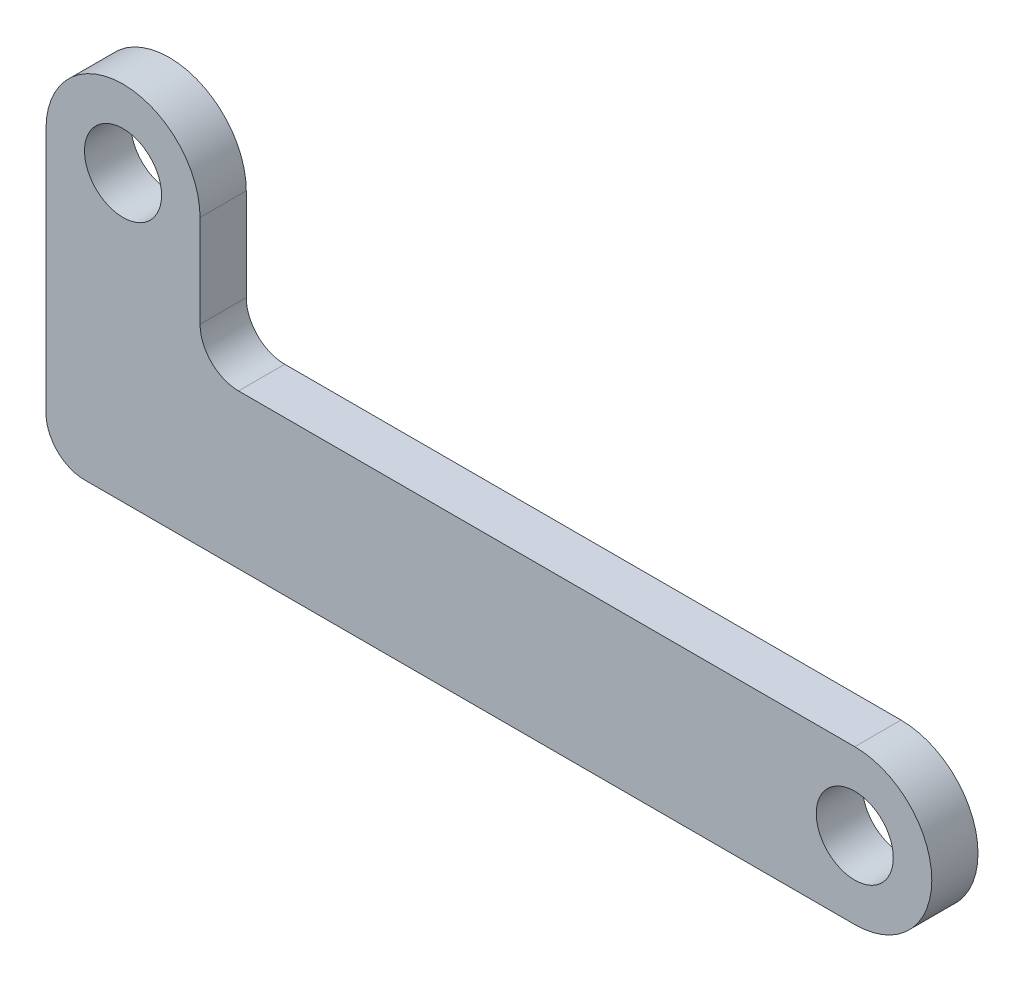
ISO-10303-21;
HEADER;
FILE_DESCRIPTION(('STEP AP214'),'2;1');
FILE_NAME('part.step','',(''),(''),'','','');
FILE_SCHEMA(('AUTOMOTIVE_DESIGN { 1 0 10303 214 1 1 1 1 }'));
ENDSEC;
DATA;
#1=APPLICATION_CONTEXT('core data for automotive mechanical design processes');
#2=APPLICATION_PROTOCOL_DEFINITION('international standard','automotive_design',2000,#1);
#3=PRODUCT_CONTEXT('',#1,'mechanical');
#4=PRODUCT('Part','Part','',(#3));
#5=PRODUCT_RELATED_PRODUCT_CATEGORY('part','',(#4));
#6=PRODUCT_DEFINITION_FORMATION('','',#4);
#7=PRODUCT_DEFINITION_CONTEXT('part definition',#1,'design');
#8=PRODUCT_DEFINITION('design','',#6,#7);
#9=PRODUCT_DEFINITION_SHAPE('','',#8);
#10=(LENGTH_UNIT() NAMED_UNIT(*) SI_UNIT(.MILLI.,.METRE.));
#11=(NAMED_UNIT(*) PLANE_ANGLE_UNIT() SI_UNIT($,.RADIAN.));
#12=(NAMED_UNIT(*) SI_UNIT($,.STERADIAN.) SOLID_ANGLE_UNIT());
#13=UNCERTAINTY_MEASURE_WITH_UNIT(LENGTH_MEASURE(1.E-05),#10,'distance_accuracy_value','');
#14=(GEOMETRIC_REPRESENTATION_CONTEXT(3) GLOBAL_UNCERTAINTY_ASSIGNED_CONTEXT((#13)) GLOBAL_UNIT_ASSIGNED_CONTEXT((#10,
#11,#12)) REPRESENTATION_CONTEXT('',''));
#15=CARTESIAN_POINT('',(0.,0.,0.));
#16=DIRECTION('',(0.,0.,1.));
#17=DIRECTION('',(1.,0.,0.));
#18=AXIS2_PLACEMENT_3D('',#15,#16,#17);
#19=CARTESIAN_POINT('',(0.,0.,3.));
#20=DIRECTION('',(0.,0.,1.));
#21=DIRECTION('',(1.,0.,0.));
#22=AXIS2_PLACEMENT_3D('',#19,#20,#21);
#23=PLANE('',#22);
#24=CARTESIAN_POINT('',(0.,0.,3.));
#25=DIRECTION('',(0.,0.,1.));
#26=DIRECTION('',(1.,0.,0.));
#27=AXIS2_PLACEMENT_3D('',#24,#25,#26);
#28=CIRCLE('',#27,2.5);
#29=CARTESIAN_POINT('',(2.5,0.,3.));
#30=VERTEX_POINT('',#29);
#31=EDGE_CURVE('E132',#30,#30,#28,.T.);
#32=ORIENTED_EDGE('',*,*,#31,.F.);
#33=EDGE_LOOP('',(#32));
#34=FACE_BOUND('',#33,.T.);
#35=CARTESIAN_POINT('',(0.,0.,3.));
#36=DIRECTION('',(0.,0.,1.));
#37=DIRECTION('',(1.,0.,0.));
#38=AXIS2_PLACEMENT_3D('',#35,#36,#37);
#39=CIRCLE('',#38,5.);
#40=CARTESIAN_POINT('',(5.,0.,3.));
#41=VERTEX_POINT('',#40);
#42=CARTESIAN_POINT('',(-5.,0.,3.));
#43=VERTEX_POINT('',#42);
#44=EDGE_CURVE('E143',#41,#43,#39,.T.);
#45=ORIENTED_EDGE('',*,*,#44,.T.);
#46=DIRECTION('',(0.,-1.,0.));
#47=VECTOR('',#46,1.);
#48=CARTESIAN_POINT('',(-5.,0.,3.));
#49=LINE('',#48,#47);
#50=CARTESIAN_POINT('',(-5.,-16.,3.));
#51=VERTEX_POINT('',#50);
#52=EDGE_CURVE('E91',#43,#51,#49,.T.);
#53=ORIENTED_EDGE('',*,*,#52,.T.);
#54=CARTESIAN_POINT('',(-2.5,-16.,3.));
#55=DIRECTION('',(0.,0.,1.));
#56=DIRECTION('',(1.,0.,0.));
#57=AXIS2_PLACEMENT_3D('',#54,#55,#56);
#58=CIRCLE('',#57,2.5);
#59=CARTESIAN_POINT('',(-2.5,-18.5,3.));
#60=VERTEX_POINT('',#59);
#61=EDGE_CURVE('E158',#51,#60,#58,.T.);
#62=ORIENTED_EDGE('',*,*,#61,.T.);
#63=DIRECTION('',(1.,0.,0.));
#64=VECTOR('',#63,1.);
#65=CARTESIAN_POINT('',(-2.5,-18.5,3.));
#66=LINE('',#65,#64);
#67=CARTESIAN_POINT('',(47.5,-18.5,3.));
#68=VERTEX_POINT('',#67);
#69=EDGE_CURVE('E171',#60,#68,#66,.T.);
#70=ORIENTED_EDGE('',*,*,#69,.T.);
#71=CARTESIAN_POINT('',(47.5,-13.5,3.));
#72=DIRECTION('',(0.,0.,1.));
#73=DIRECTION('',(-1.,0.,0.));
#74=AXIS2_PLACEMENT_3D('',#71,#72,#73);
#75=CIRCLE('',#74,5.);
#76=CARTESIAN_POINT('',(47.5,-8.5,3.));
#77=VERTEX_POINT('',#76);
#78=EDGE_CURVE('E110',#68,#77,#75,.T.);
#79=ORIENTED_EDGE('',*,*,#78,.T.);
#80=DIRECTION('',(-1.,0.,0.));
#81=VECTOR('',#80,1.);
#82=CARTESIAN_POINT('',(7.5,-8.50000000000001,3.));
#83=LINE('',#82,#81);
#84=CARTESIAN_POINT('',(7.5,-8.5,3.));
#85=VERTEX_POINT('',#84);
#86=EDGE_CURVE('E104',#77,#85,#83,.T.);
#87=ORIENTED_EDGE('',*,*,#86,.T.);
#88=CARTESIAN_POINT('',(7.5,-6.,3.));
#89=DIRECTION('',(0.,0.,-1.));
#90=DIRECTION('',(1.,0.,0.));
#91=AXIS2_PLACEMENT_3D('',#88,#89,#90);
#92=CIRCLE('',#91,2.5);
#93=CARTESIAN_POINT('',(5.,-6.,3.));
#94=VERTEX_POINT('',#93);
#95=EDGE_CURVE('E108',#85,#94,#92,.T.);
#96=ORIENTED_EDGE('',*,*,#95,.T.);
#97=DIRECTION('',(0.,1.,0.));
#98=VECTOR('',#97,1.);
#99=CARTESIAN_POINT('',(5.,0.,3.));
#100=LINE('',#99,#98);
#101=EDGE_CURVE('E48',#94,#41,#100,.T.);
#102=ORIENTED_EDGE('',*,*,#101,.T.);
#103=EDGE_LOOP('',(#45,#53,#62,#70,#79,#87,#96,#102));
#104=FACE_BOUND('',#103,.T.);
#105=CARTESIAN_POINT('',(47.5,-13.5,3.));
#106=DIRECTION('',(0.,0.,1.));
#107=DIRECTION('',(1.,0.,0.));
#108=AXIS2_PLACEMENT_3D('',#105,#106,#107);
#109=CIRCLE('',#108,2.5);
#110=CARTESIAN_POINT('',(50.,-13.5,3.));
#111=VERTEX_POINT('',#110);
#112=EDGE_CURVE('E180',#111,#111,#109,.T.);
#113=ORIENTED_EDGE('',*,*,#112,.F.);
#114=EDGE_LOOP('',(#113));
#115=FACE_BOUND('',#114,.T.);
#116=ADVANCED_FACE('F31',(#34,#104,#115),#23,.T.);
#117=CARTESIAN_POINT('',(0.,0.,0.));
#118=DIRECTION('',(0.,0.,1.));
#119=DIRECTION('',(1.,0.,0.));
#120=AXIS2_PLACEMENT_3D('',#117,#118,#119);
#121=PLANE('',#120);
#122=CARTESIAN_POINT('',(0.,0.,0.));
#123=DIRECTION('',(0.,0.,1.));
#124=DIRECTION('',(1.,0.,0.));
#125=AXIS2_PLACEMENT_3D('',#122,#123,#124);
#126=CIRCLE('',#125,2.5);
#127=CARTESIAN_POINT('',(2.5,0.,0.));
#128=VERTEX_POINT('',#127);
#129=EDGE_CURVE('E177',#128,#128,#126,.T.);
#130=ORIENTED_EDGE('',*,*,#129,.T.);
#131=EDGE_LOOP('',(#130));
#132=FACE_BOUND('',#131,.T.);
#133=CARTESIAN_POINT('',(0.,0.,0.));
#134=DIRECTION('',(0.,0.,1.));
#135=DIRECTION('',(1.,0.,0.));
#136=AXIS2_PLACEMENT_3D('',#133,#134,#135);
#137=CIRCLE('',#136,5.);
#138=CARTESIAN_POINT('',(5.,0.,0.));
#139=VERTEX_POINT('',#138);
#140=CARTESIAN_POINT('',(-5.,0.,0.));
#141=VERTEX_POINT('',#140);
#142=EDGE_CURVE('E128',#139,#141,#137,.T.);
#143=ORIENTED_EDGE('',*,*,#142,.F.);
#144=DIRECTION('',(0.,1.,0.));
#145=VECTOR('',#144,1.);
#146=CARTESIAN_POINT('',(5.,0.,0.));
#147=LINE('',#146,#145);
#148=CARTESIAN_POINT('',(5.,-6.,0.));
#149=VERTEX_POINT('',#148);
#150=EDGE_CURVE('E83',#149,#139,#147,.T.);
#151=ORIENTED_EDGE('',*,*,#150,.F.);
#152=CARTESIAN_POINT('',(7.5,-6.,0.));
#153=DIRECTION('',(0.,0.,-1.));
#154=DIRECTION('',(1.,0.,0.));
#155=AXIS2_PLACEMENT_3D('',#152,#153,#154);
#156=CIRCLE('',#155,2.5);
#157=CARTESIAN_POINT('',(7.5,-8.5,0.));
#158=VERTEX_POINT('',#157);
#159=EDGE_CURVE('E77',#158,#149,#156,.T.);
#160=ORIENTED_EDGE('',*,*,#159,.F.);
#161=DIRECTION('',(-1.,0.,0.));
#162=VECTOR('',#161,1.);
#163=CARTESIAN_POINT('',(7.5,-8.50000000000001,0.));
#164=LINE('',#163,#162);
#165=CARTESIAN_POINT('',(47.5,-8.5,0.));
#166=VERTEX_POINT('',#165);
#167=EDGE_CURVE('E118',#166,#158,#164,.T.);
#168=ORIENTED_EDGE('',*,*,#167,.F.);
#169=CARTESIAN_POINT('',(47.5,-13.5,0.));
#170=DIRECTION('',(0.,0.,1.));
#171=DIRECTION('',(-1.,0.,0.));
#172=AXIS2_PLACEMENT_3D('',#169,#170,#171);
#173=CIRCLE('',#172,5.);
#174=CARTESIAN_POINT('',(47.5,-18.5,0.));
#175=VERTEX_POINT('',#174);
#176=EDGE_CURVE('E138',#175,#166,#173,.T.);
#177=ORIENTED_EDGE('',*,*,#176,.F.);
#178=DIRECTION('',(1.,0.,0.));
#179=VECTOR('',#178,1.);
#180=CARTESIAN_POINT('',(-2.5,-18.5,0.));
#181=LINE('',#180,#179);
#182=CARTESIAN_POINT('',(-2.5,-18.5,0.));
#183=VERTEX_POINT('',#182);
#184=EDGE_CURVE('E136',#183,#175,#181,.T.);
#185=ORIENTED_EDGE('',*,*,#184,.F.);
#186=CARTESIAN_POINT('',(-2.5,-16.,0.));
#187=DIRECTION('',(0.,0.,1.));
#188=DIRECTION('',(1.,0.,0.));
#189=AXIS2_PLACEMENT_3D('',#186,#187,#188);
#190=CIRCLE('',#189,2.5);
#191=CARTESIAN_POINT('',(-5.,-16.,0.));
#192=VERTEX_POINT('',#191);
#193=EDGE_CURVE('E134',#192,#183,#190,.T.);
#194=ORIENTED_EDGE('',*,*,#193,.F.);
#195=DIRECTION('',(0.,-1.,0.));
#196=VECTOR('',#195,1.);
#197=CARTESIAN_POINT('',(-5.,0.,0.));
#198=LINE('',#197,#196);
#199=EDGE_CURVE('E131',#141,#192,#198,.T.);
#200=ORIENTED_EDGE('',*,*,#199,.F.);
#201=EDGE_LOOP('',(#143,#151,#160,#168,#177,#185,#194,#200));
#202=FACE_BOUND('',#201,.T.);
#203=CARTESIAN_POINT('',(47.5,-13.5,0.));
#204=DIRECTION('',(0.,0.,1.));
#205=DIRECTION('',(1.,0.,0.));
#206=AXIS2_PLACEMENT_3D('',#203,#204,#205);
#207=CIRCLE('',#206,2.5);
#208=CARTESIAN_POINT('',(50.,-13.5,0.));
#209=VERTEX_POINT('',#208);
#210=EDGE_CURVE('E183',#209,#209,#207,.T.);
#211=ORIENTED_EDGE('',*,*,#210,.T.);
#212=EDGE_LOOP('',(#211));
#213=FACE_BOUND('',#212,.T.);
#214=ADVANCED_FACE('F162',(#132,#202,#213),#121,.F.);
#215=CARTESIAN_POINT('',(0.,0.,3.));
#216=DIRECTION('',(0.,0.,-1.));
#217=DIRECTION('',(-1.,0.,0.));
#218=AXIS2_PLACEMENT_3D('',#215,#216,#217);
#219=CYLINDRICAL_SURFACE('',#218,5.);
#220=ORIENTED_EDGE('',*,*,#142,.T.);
#221=DIRECTION('',(0.,0.,-1.));
#222=VECTOR('',#221,1.);
#223=CARTESIAN_POINT('',(-5.,0.,3.));
#224=LINE('',#223,#222);
#225=EDGE_CURVE('E11',#43,#141,#224,.T.);
#226=ORIENTED_EDGE('',*,*,#225,.F.);
#227=ORIENTED_EDGE('',*,*,#44,.F.);
#228=DIRECTION('',(0.,0.,-1.));
#229=VECTOR('',#228,1.);
#230=CARTESIAN_POINT('',(5.,0.,3.));
#231=LINE('',#230,#229);
#232=EDGE_CURVE('E124',#41,#139,#231,.T.);
#233=ORIENTED_EDGE('',*,*,#232,.T.);
#234=EDGE_LOOP('',(#220,#226,#227,#233));
#235=FACE_BOUND('',#234,.T.);
#236=ADVANCED_FACE('F33',(#235),#219,.T.);
#237=CARTESIAN_POINT('',(-5.,0.,3.));
#238=DIRECTION('',(1.,0.,0.));
#239=DIRECTION('',(0.,1.,0.));
#240=AXIS2_PLACEMENT_3D('',#237,#238,#239);
#241=PLANE('',#240);
#242=ORIENTED_EDGE('',*,*,#199,.T.);
#243=DIRECTION('',(0.,0.,-1.));
#244=VECTOR('',#243,1.);
#245=CARTESIAN_POINT('',(-5.,-16.,3.));
#246=LINE('',#245,#244);
#247=EDGE_CURVE('E40',#51,#192,#246,.T.);
#248=ORIENTED_EDGE('',*,*,#247,.F.);
#249=ORIENTED_EDGE('',*,*,#52,.F.);
#250=ORIENTED_EDGE('',*,*,#225,.T.);
#251=EDGE_LOOP('',(#242,#248,#249,#250));
#252=FACE_BOUND('',#251,.T.);
#253=ADVANCED_FACE('F216',(#252),#241,.F.);
#254=CARTESIAN_POINT('',(-2.5,-16.,3.));
#255=DIRECTION('',(0.,0.,-1.));
#256=DIRECTION('',(-1.,0.,0.));
#257=AXIS2_PLACEMENT_3D('',#254,#255,#256);
#258=CYLINDRICAL_SURFACE('',#257,2.5);
#259=ORIENTED_EDGE('',*,*,#193,.T.);
#260=DIRECTION('',(0.,0.,-1.));
#261=VECTOR('',#260,1.);
#262=CARTESIAN_POINT('',(-2.5,-18.5,3.));
#263=LINE('',#262,#261);
#264=EDGE_CURVE('E150',#60,#183,#263,.T.);
#265=ORIENTED_EDGE('',*,*,#264,.F.);
#266=ORIENTED_EDGE('',*,*,#61,.F.);
#267=ORIENTED_EDGE('',*,*,#247,.T.);
#268=EDGE_LOOP('',(#259,#265,#266,#267));
#269=FACE_BOUND('',#268,.T.);
#270=ADVANCED_FACE('F156',(#269),#258,.T.);
#271=CARTESIAN_POINT('',(-2.5,-18.5,3.));
#272=DIRECTION('',(0.,1.,0.));
#273=DIRECTION('',(0.,0.,1.));
#274=AXIS2_PLACEMENT_3D('',#271,#272,#273);
#275=PLANE('',#274);
#276=ORIENTED_EDGE('',*,*,#184,.T.);
#277=DIRECTION('',(0.,0.,-1.));
#278=VECTOR('',#277,1.);
#279=CARTESIAN_POINT('',(47.5,-18.5,3.));
#280=LINE('',#279,#278);
#281=EDGE_CURVE('E147',#68,#175,#280,.T.);
#282=ORIENTED_EDGE('',*,*,#281,.F.);
#283=ORIENTED_EDGE('',*,*,#69,.F.);
#284=ORIENTED_EDGE('',*,*,#264,.T.);
#285=EDGE_LOOP('',(#276,#282,#283,#284));
#286=FACE_BOUND('',#285,.T.);
#287=ADVANCED_FACE('F167',(#286),#275,.F.);
#288=CARTESIAN_POINT('',(47.5,-13.5,3.));
#289=DIRECTION('',(0.,0.,-1.));
#290=DIRECTION('',(-1.,0.,0.));
#291=AXIS2_PLACEMENT_3D('',#288,#289,#290);
#292=CYLINDRICAL_SURFACE('',#291,5.);
#293=ORIENTED_EDGE('',*,*,#176,.T.);
#294=DIRECTION('',(0.,0.,-1.));
#295=VECTOR('',#294,1.);
#296=CARTESIAN_POINT('',(47.5,-8.5,3.));
#297=LINE('',#296,#295);
#298=EDGE_CURVE('E119',#77,#166,#297,.T.);
#299=ORIENTED_EDGE('',*,*,#298,.F.);
#300=ORIENTED_EDGE('',*,*,#78,.F.);
#301=ORIENTED_EDGE('',*,*,#281,.T.);
#302=EDGE_LOOP('',(#293,#299,#300,#301));
#303=FACE_BOUND('',#302,.T.);
#304=ADVANCED_FACE('F170',(#303),#292,.T.);
#305=CARTESIAN_POINT('',(7.5,-8.50000000000001,3.));
#306=DIRECTION('',(0.,-1.,0.));
#307=DIRECTION('',(1.,0.,0.));
#308=AXIS2_PLACEMENT_3D('',#305,#306,#307);
#309=PLANE('',#308);
#310=ORIENTED_EDGE('',*,*,#167,.T.);
#311=DIRECTION('',(0.,0.,-1.));
#312=VECTOR('',#311,1.);
#313=CARTESIAN_POINT('',(7.5,-8.5,3.));
#314=LINE('',#313,#312);
#315=EDGE_CURVE('E115',#85,#158,#314,.T.);
#316=ORIENTED_EDGE('',*,*,#315,.F.);
#317=ORIENTED_EDGE('',*,*,#86,.F.);
#318=ORIENTED_EDGE('',*,*,#298,.T.);
#319=EDGE_LOOP('',(#310,#316,#317,#318));
#320=FACE_BOUND('',#319,.T.);
#321=ADVANCED_FACE('F116',(#320),#309,.F.);
#322=CARTESIAN_POINT('',(7.5,-6.,3.));
#323=DIRECTION('',(0.,0.,-1.));
#324=DIRECTION('',(-1.,0.,0.));
#325=AXIS2_PLACEMENT_3D('',#322,#323,#324);
#326=CYLINDRICAL_SURFACE('',#325,2.5);
#327=ORIENTED_EDGE('',*,*,#159,.T.);
#328=DIRECTION('',(0.,0.,-1.));
#329=VECTOR('',#328,1.);
#330=CARTESIAN_POINT('',(5.,-6.,3.));
#331=LINE('',#330,#329);
#332=EDGE_CURVE('E120',#94,#149,#331,.T.);
#333=ORIENTED_EDGE('',*,*,#332,.F.);
#334=ORIENTED_EDGE('',*,*,#95,.F.);
#335=ORIENTED_EDGE('',*,*,#315,.T.);
#336=EDGE_LOOP('',(#327,#333,#334,#335));
#337=FACE_BOUND('',#336,.T.);
#338=ADVANCED_FACE('F122',(#337),#326,.F.);
#339=CARTESIAN_POINT('',(5.,0.,3.));
#340=DIRECTION('',(-1.,0.,0.));
#341=DIRECTION('',(0.,-1.,0.));
#342=AXIS2_PLACEMENT_3D('',#339,#340,#341);
#343=PLANE('',#342);
#344=ORIENTED_EDGE('',*,*,#150,.T.);
#345=ORIENTED_EDGE('',*,*,#232,.F.);
#346=ORIENTED_EDGE('',*,*,#101,.F.);
#347=ORIENTED_EDGE('',*,*,#332,.T.);
#348=EDGE_LOOP('',(#344,#345,#346,#347));
#349=FACE_BOUND('',#348,.T.);
#350=ADVANCED_FACE('F204',(#349),#343,.F.);
#351=CARTESIAN_POINT('',(0.,0.,3.));
#352=DIRECTION('',(0.,0.,-1.));
#353=DIRECTION('',(-1.,0.,0.));
#354=AXIS2_PLACEMENT_3D('',#351,#352,#353);
#355=CYLINDRICAL_SURFACE('',#354,2.5);
#356=ORIENTED_EDGE('',*,*,#31,.T.);
#357=EDGE_LOOP('',(#356));
#358=FACE_BOUND('',#357,.T.);
#359=ORIENTED_EDGE('',*,*,#129,.F.);
#360=EDGE_LOOP('',(#359));
#361=FACE_BOUND('',#360,.T.);
#362=ADVANCED_FACE('F201',(#358,#361),#355,.F.);
#363=CARTESIAN_POINT('',(47.5,-13.5,3.));
#364=DIRECTION('',(0.,0.,-1.));
#365=DIRECTION('',(-1.,0.,0.));
#366=AXIS2_PLACEMENT_3D('',#363,#364,#365);
#367=CYLINDRICAL_SURFACE('',#366,2.5);
#368=ORIENTED_EDGE('',*,*,#112,.T.);
#369=EDGE_LOOP('',(#368));
#370=FACE_BOUND('',#369,.T.);
#371=ORIENTED_EDGE('',*,*,#210,.F.);
#372=EDGE_LOOP('',(#371));
#373=FACE_BOUND('',#372,.T.);
#374=ADVANCED_FACE('F189',(#370,#373),#367,.F.);
#375=CLOSED_SHELL('',(#116,#214,#236,#253,#270,#287,#304,#321,#338,#350,#362,#374));
#376=MANIFOLD_SOLID_BREP('B2',#375);
#377=ADVANCED_BREP_SHAPE_REPRESENTATION('',(#18,#376),#14);
#378=SHAPE_DEFINITION_REPRESENTATION(#9,#377);
ENDSEC;
END-ISO-10303-21;
